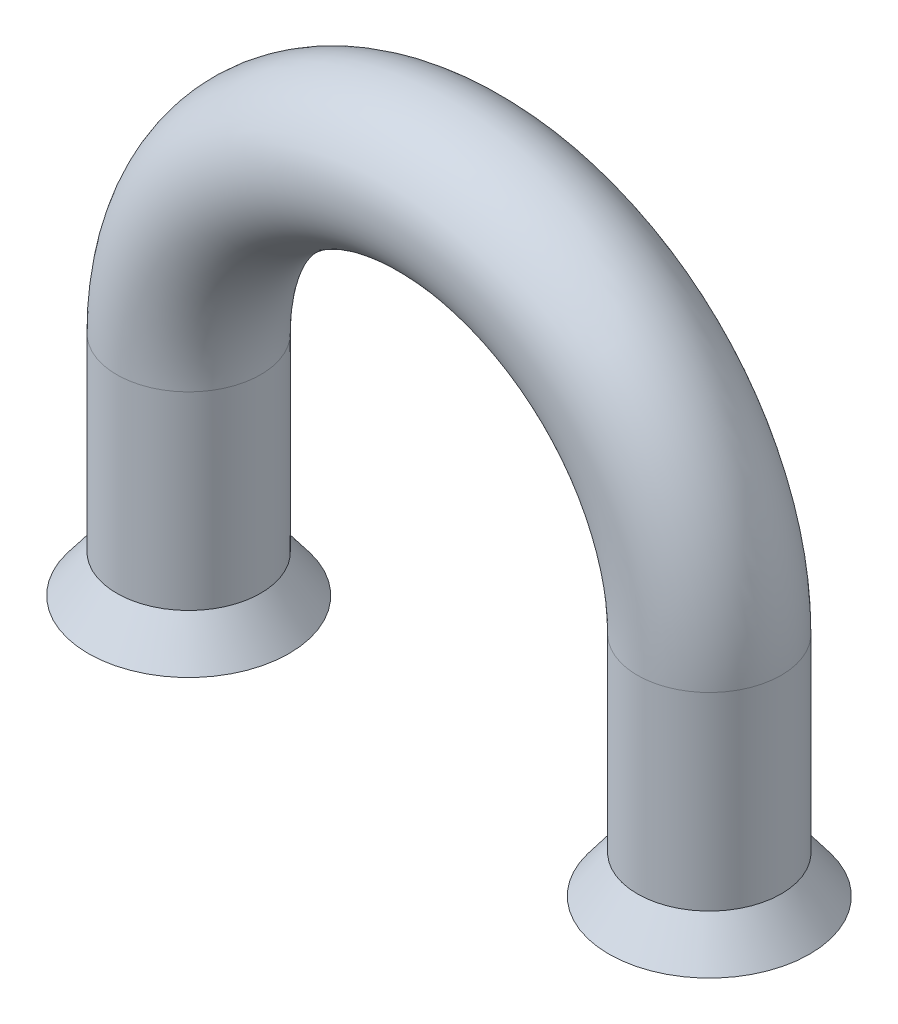
ISO-10303-21;
HEADER;
FILE_DESCRIPTION(('STEP AP214'),'2;1');
FILE_NAME('part.step','',(''),(''),'','','');
FILE_SCHEMA(('AUTOMOTIVE_DESIGN { 1 0 10303 214 1 1 1 1 }'));
ENDSEC;
DATA;
#1=APPLICATION_CONTEXT('core data for automotive mechanical design processes');
#2=APPLICATION_PROTOCOL_DEFINITION('international standard','automotive_design',2000,#1);
#3=PRODUCT_CONTEXT('',#1,'mechanical');
#4=PRODUCT('Part','Part','',(#3));
#5=PRODUCT_RELATED_PRODUCT_CATEGORY('part','',(#4));
#6=PRODUCT_DEFINITION_FORMATION('','',#4);
#7=PRODUCT_DEFINITION_CONTEXT('part definition',#1,'design');
#8=PRODUCT_DEFINITION('design','',#6,#7);
#9=PRODUCT_DEFINITION_SHAPE('','',#8);
#10=(LENGTH_UNIT() NAMED_UNIT(*) SI_UNIT(.MILLI.,.METRE.));
#11=(NAMED_UNIT(*) PLANE_ANGLE_UNIT() SI_UNIT($,.RADIAN.));
#12=(NAMED_UNIT(*) SI_UNIT($,.STERADIAN.) SOLID_ANGLE_UNIT());
#13=UNCERTAINTY_MEASURE_WITH_UNIT(LENGTH_MEASURE(1.E-05),#10,'distance_accuracy_value','');
#14=(GEOMETRIC_REPRESENTATION_CONTEXT(3) GLOBAL_UNCERTAINTY_ASSIGNED_CONTEXT((#13)) GLOBAL_UNIT_ASSIGNED_CONTEXT((#10,
#11,#12)) REPRESENTATION_CONTEXT('',''));
#15=CARTESIAN_POINT('',(0.,0.,0.));
#16=DIRECTION('',(0.,0.,1.));
#17=DIRECTION('',(1.,0.,0.));
#18=AXIS2_PLACEMENT_3D('',#15,#16,#17);
#19=CARTESIAN_POINT('',(0.,0.,0.));
#20=DIRECTION('',(0.,1.,0.));
#21=DIRECTION('',(0.,0.,1.));
#22=AXIS2_PLACEMENT_3D('',#19,#20,#21);
#23=CYLINDRICAL_SURFACE('',#22,4.826);
#24=CARTESIAN_POINT('',(0.,12.7,0.));
#25=DIRECTION('',(0.,1.,0.));
#26=DIRECTION('',(0.,0.,1.));
#27=AXIS2_PLACEMENT_3D('',#24,#25,#26);
#28=CIRCLE('',#27,4.826);
#29=CARTESIAN_POINT('',(-4.826,12.7,0.));
#30=VERTEX_POINT('',#29);
#31=EDGE_CURVE('E58',#30,#30,#28,.T.);
#32=ORIENTED_EDGE('',*,*,#31,.F.);
#33=EDGE_LOOP('',(#32));
#34=FACE_BOUND('',#33,.T.);
#35=CARTESIAN_POINT('',(0.,0.,0.));
#36=DIRECTION('',(0.,-1.,0.));
#37=DIRECTION('',(0.,0.,-1.));
#38=AXIS2_PLACEMENT_3D('',#35,#36,#37);
#39=CIRCLE('',#38,4.826);
#40=CARTESIAN_POINT('',(0.,0.,-4.826));
#41=VERTEX_POINT('',#40);
#42=EDGE_CURVE('E68',#41,#41,#39,.T.);
#43=ORIENTED_EDGE('',*,*,#42,.F.);
#44=EDGE_LOOP('',(#43));
#45=FACE_BOUND('',#44,.T.);
#46=ADVANCED_FACE('F37',(#34,#45),#23,.T.);
#47=CARTESIAN_POINT('',(17.4625,12.7,0.));
#48=DIRECTION('',(0.,0.,-1.));
#49=DIRECTION('',(-1.,0.,0.));
#50=AXIS2_PLACEMENT_3D('',#47,#48,#49);
#51=TOROIDAL_SURFACE('',#50,17.4625,4.826);
#52=CARTESIAN_POINT('',(34.925,12.7,0.));
#53=DIRECTION('',(0.,-1.,0.));
#54=DIRECTION('',(0.,0.,1.));
#55=AXIS2_PLACEMENT_3D('',#52,#53,#54);
#56=CIRCLE('',#55,4.826);
#57=CARTESIAN_POINT('',(39.751,12.7,0.));
#58=VERTEX_POINT('',#57);
#59=EDGE_CURVE('E41',#58,#58,#56,.T.);
#60=CARTESIAN_POINT('',(17.4625,12.7,0.));
#61=DIRECTION('',(0.,0.,-1.));
#62=DIRECTION('',(-1.,0.,0.));
#63=AXIS2_PLACEMENT_3D('',#60,#61,#62);
#64=CIRCLE('',#63,22.2885);
#65=EDGE_CURVE('',#30,#58,#64,.T.);
#66=ORIENTED_EDGE('',*,*,#31,.T.);
#67=ORIENTED_EDGE('',*,*,#59,.F.);
#68=ORIENTED_EDGE('',*,*,#65,.T.);
#69=ORIENTED_EDGE('',*,*,#65,.F.);
#70=EDGE_LOOP('',(#66,#68,#67,#69));
#71=FACE_BOUND('',#70,.T.);
#72=ADVANCED_FACE('F115',(#71),#51,.T.);
#73=CARTESIAN_POINT('',(34.925,12.7,0.));
#74=DIRECTION('',(0.,-1.,0.));
#75=DIRECTION('',(0.,0.,-1.));
#76=AXIS2_PLACEMENT_3D('',#73,#74,#75);
#77=CYLINDRICAL_SURFACE('',#76,4.826);
#78=CARTESIAN_POINT('',(34.925,0.,0.));
#79=DIRECTION('',(0.,-1.,0.));
#80=DIRECTION('',(0.,0.,1.));
#81=AXIS2_PLACEMENT_3D('',#78,#79,#80);
#82=CIRCLE('',#81,4.826);
#83=CARTESIAN_POINT('',(34.925,0.,4.826));
#84=VERTEX_POINT('',#83);
#85=EDGE_CURVE('E52',#84,#84,#82,.T.);
#86=ORIENTED_EDGE('',*,*,#85,.F.);
#87=EDGE_LOOP('',(#86));
#88=FACE_BOUND('',#87,.T.);
#89=ORIENTED_EDGE('',*,*,#59,.T.);
#90=EDGE_LOOP('',(#89));
#91=FACE_BOUND('',#90,.T.);
#92=ADVANCED_FACE('F39',(#88,#91),#77,.T.);
#93=CARTESIAN_POINT('',(0.,0.,0.));
#94=DIRECTION('',(0.,1.,0.));
#95=DIRECTION('',(0.,0.,1.));
#96=AXIS2_PLACEMENT_3D('',#93,#94,#95);
#97=CYLINDRICAL_SURFACE('',#96,4.064);
#98=CARTESIAN_POINT('',(0.,12.7,0.));
#99=DIRECTION('',(0.,1.,0.));
#100=DIRECTION('',(0.,0.,1.));
#101=AXIS2_PLACEMENT_3D('',#98,#99,#100);
#102=CIRCLE('',#101,4.064);
#103=CARTESIAN_POINT('',(-4.06400000000001,12.7,0.));
#104=VERTEX_POINT('',#103);
#105=EDGE_CURVE('E46',#104,#104,#102,.F.);
#106=ORIENTED_EDGE('',*,*,#105,.F.);
#107=EDGE_LOOP('',(#106));
#108=FACE_BOUND('',#107,.T.);
#109=CARTESIAN_POINT('',(0.,0.,0.));
#110=DIRECTION('',(0.,-1.,0.));
#111=DIRECTION('',(0.,0.,-1.));
#112=AXIS2_PLACEMENT_3D('',#109,#110,#111);
#113=CIRCLE('',#112,4.064);
#114=CARTESIAN_POINT('',(0.,0.,-4.064));
#115=VERTEX_POINT('',#114);
#116=EDGE_CURVE('E73',#115,#115,#113,.T.);
#117=ORIENTED_EDGE('',*,*,#116,.T.);
#118=EDGE_LOOP('',(#117));
#119=FACE_BOUND('',#118,.T.);
#120=ADVANCED_FACE('F114',(#108,#119),#97,.F.);
#121=CARTESIAN_POINT('',(17.4625,12.7,0.));
#122=DIRECTION('',(0.,0.,-1.));
#123=DIRECTION('',(-1.,0.,0.));
#124=AXIS2_PLACEMENT_3D('',#121,#122,#123);
#125=TOROIDAL_SURFACE('',#124,17.4625,4.064);
#126=CARTESIAN_POINT('',(34.925,12.7,0.));
#127=DIRECTION('',(0.,-1.,0.));
#128=DIRECTION('',(0.,0.,1.));
#129=AXIS2_PLACEMENT_3D('',#126,#127,#128);
#130=CIRCLE('',#129,4.064);
#131=CARTESIAN_POINT('',(38.989,12.7,0.));
#132=VERTEX_POINT('',#131);
#133=EDGE_CURVE('E10',#132,#132,#130,.F.);
#134=CARTESIAN_POINT('',(17.4625,12.7,0.));
#135=DIRECTION('',(0.,0.,-1.));
#136=DIRECTION('',(-1.,0.,0.));
#137=AXIS2_PLACEMENT_3D('',#134,#135,#136);
#138=CIRCLE('',#137,21.5265);
#139=EDGE_CURVE('',#104,#132,#138,.T.);
#140=ORIENTED_EDGE('',*,*,#105,.T.);
#141=ORIENTED_EDGE('',*,*,#133,.F.);
#142=ORIENTED_EDGE('',*,*,#139,.T.);
#143=ORIENTED_EDGE('',*,*,#139,.F.);
#144=EDGE_LOOP('',(#140,#142,#141,#143));
#145=FACE_BOUND('',#144,.T.);
#146=ADVANCED_FACE('F127',(#145),#125,.F.);
#147=CARTESIAN_POINT('',(34.925,12.7,0.));
#148=DIRECTION('',(0.,-1.,0.));
#149=DIRECTION('',(0.,0.,-1.));
#150=AXIS2_PLACEMENT_3D('',#147,#148,#149);
#151=CYLINDRICAL_SURFACE('',#150,4.064);
#152=CARTESIAN_POINT('',(34.925,0.,0.));
#153=DIRECTION('',(0.,-1.,0.));
#154=DIRECTION('',(1.,0.,0.));
#155=AXIS2_PLACEMENT_3D('',#152,#153,#154);
#156=CIRCLE('',#155,4.064);
#157=CARTESIAN_POINT('',(38.989,0.,0.));
#158=VERTEX_POINT('',#157);
#159=EDGE_CURVE('E87',#158,#158,#156,.T.);
#160=ORIENTED_EDGE('',*,*,#159,.T.);
#161=EDGE_LOOP('',(#160));
#162=FACE_BOUND('',#161,.T.);
#163=ORIENTED_EDGE('',*,*,#133,.T.);
#164=EDGE_LOOP('',(#163));
#165=FACE_BOUND('',#164,.T.);
#166=ADVANCED_FACE('F125',(#162,#165),#151,.F.);
#167=CARTESIAN_POINT('',(0.,0.,0.));
#168=DIRECTION('',(0.,-1.,0.));
#169=DIRECTION('',(0.,0.,-1.));
#170=AXIS2_PLACEMENT_3D('',#167,#168,#169);
#171=CONICAL_SURFACE('',#170,4.826,0.645771823237903);
#172=CARTESIAN_POINT('',(0.,-2.54,0.));
#173=DIRECTION('',(0.,-1.,0.));
#174=DIRECTION('',(0.,0.,-1.));
#175=AXIS2_PLACEMENT_3D('',#172,#173,#174);
#176=CIRCLE('',#175,6.7400272872611);
#177=CARTESIAN_POINT('',(0.,-2.54,-6.7400272872611));
#178=VERTEX_POINT('',#177);
#179=EDGE_CURVE('E61',#178,#178,#176,.T.);
#180=ORIENTED_EDGE('',*,*,#179,.F.);
#181=EDGE_LOOP('',(#180));
#182=FACE_BOUND('',#181,.T.);
#183=ORIENTED_EDGE('',*,*,#42,.T.);
#184=EDGE_LOOP('',(#183));
#185=FACE_BOUND('',#184,.T.);
#186=ADVANCED_FACE('F124',(#182,#185),#171,.T.);
#187=CARTESIAN_POINT('',(0.,-2.54,0.));
#188=DIRECTION('',(0.,-1.,0.));
#189=DIRECTION('',(0.,0.,-1.));
#190=AXIS2_PLACEMENT_3D('',#187,#188,#189);
#191=PLANE('',#190);
#192=CARTESIAN_POINT('',(0.,-2.54,0.));
#193=DIRECTION('',(0.,-1.,0.));
#194=DIRECTION('',(0.,0.,-1.));
#195=AXIS2_PLACEMENT_3D('',#192,#193,#194);
#196=CIRCLE('',#195,5.9780272872611);
#197=CARTESIAN_POINT('',(0.,-2.54,-5.9780272872611));
#198=VERTEX_POINT('',#197);
#199=EDGE_CURVE('E79',#198,#198,#196,.T.);
#200=ORIENTED_EDGE('',*,*,#199,.F.);
#201=EDGE_LOOP('',(#200));
#202=FACE_BOUND('',#201,.T.);
#203=ORIENTED_EDGE('',*,*,#179,.T.);
#204=EDGE_LOOP('',(#203));
#205=FACE_BOUND('',#204,.T.);
#206=ADVANCED_FACE('F134',(#202,#205),#191,.T.);
#207=CARTESIAN_POINT('',(0.,-2.54,0.));
#208=DIRECTION('',(0.,-1.,0.));
#209=DIRECTION('',(0.,0.,-1.));
#210=AXIS2_PLACEMENT_3D('',#207,#208,#209);
#211=CONICAL_SURFACE('',#210,5.9780272872611,0.645771823237903);
#212=ORIENTED_EDGE('',*,*,#199,.T.);
#213=EDGE_LOOP('',(#212));
#214=FACE_BOUND('',#213,.T.);
#215=ORIENTED_EDGE('',*,*,#116,.F.);
#216=EDGE_LOOP('',(#215));
#217=FACE_BOUND('',#216,.T.);
#218=ADVANCED_FACE('F108',(#214,#217),#211,.F.);
#219=CARTESIAN_POINT('',(34.925,0.,0.));
#220=DIRECTION('',(0.,-1.,0.));
#221=DIRECTION('',(1.,0.,0.));
#222=AXIS2_PLACEMENT_3D('',#219,#220,#221);
#223=CONICAL_SURFACE('',#222,4.826,0.645771823237903);
#224=CARTESIAN_POINT('',(34.925,-2.54,0.));
#225=DIRECTION('',(0.,-1.,0.));
#226=DIRECTION('',(1.,0.,0.));
#227=AXIS2_PLACEMENT_3D('',#224,#225,#226);
#228=CIRCLE('',#227,6.7400272872611);
#229=CARTESIAN_POINT('',(41.6650272872611,-2.54,0.));
#230=VERTEX_POINT('',#229);
#231=EDGE_CURVE('E83',#230,#230,#228,.T.);
#232=ORIENTED_EDGE('',*,*,#231,.F.);
#233=EDGE_LOOP('',(#232));
#234=FACE_BOUND('',#233,.T.);
#235=ORIENTED_EDGE('',*,*,#85,.T.);
#236=EDGE_LOOP('',(#235));
#237=FACE_BOUND('',#236,.T.);
#238=ADVANCED_FACE('F102',(#234,#237),#223,.T.);
#239=CARTESIAN_POINT('',(34.925,-2.54,0.));
#240=DIRECTION('',(0.,-1.,0.));
#241=DIRECTION('',(1.,0.,0.));
#242=AXIS2_PLACEMENT_3D('',#239,#240,#241);
#243=PLANE('',#242);
#244=CARTESIAN_POINT('',(34.925,-2.54,0.));
#245=DIRECTION('',(0.,-1.,0.));
#246=DIRECTION('',(1.,0.,0.));
#247=AXIS2_PLACEMENT_3D('',#244,#245,#246);
#248=CIRCLE('',#247,5.9780272872611);
#249=CARTESIAN_POINT('',(40.9030272872611,-2.54,0.));
#250=VERTEX_POINT('',#249);
#251=EDGE_CURVE('E91',#250,#250,#248,.T.);
#252=ORIENTED_EDGE('',*,*,#251,.F.);
#253=EDGE_LOOP('',(#252));
#254=FACE_BOUND('',#253,.T.);
#255=ORIENTED_EDGE('',*,*,#231,.T.);
#256=EDGE_LOOP('',(#255));
#257=FACE_BOUND('',#256,.T.);
#258=ADVANCED_FACE('F99',(#254,#257),#243,.T.);
#259=CARTESIAN_POINT('',(34.925,-2.54,0.));
#260=DIRECTION('',(0.,-1.,0.));
#261=DIRECTION('',(1.,0.,0.));
#262=AXIS2_PLACEMENT_3D('',#259,#260,#261);
#263=CONICAL_SURFACE('',#262,5.9780272872611,0.645771823237903);
#264=ORIENTED_EDGE('',*,*,#251,.T.);
#265=EDGE_LOOP('',(#264));
#266=FACE_BOUND('',#265,.T.);
#267=ORIENTED_EDGE('',*,*,#159,.F.);
#268=EDGE_LOOP('',(#267));
#269=FACE_BOUND('',#268,.T.);
#270=ADVANCED_FACE('F96',(#266,#269),#263,.F.);
#271=CLOSED_SHELL('',(#46,#72,#92,#120,#146,#166,#186,#206,#218,#238,#258,#270));
#272=MANIFOLD_SOLID_BREP('B2',#271);
#273=ADVANCED_BREP_SHAPE_REPRESENTATION('',(#18,#272),#14);
#274=SHAPE_DEFINITION_REPRESENTATION(#9,#273);
ENDSEC;
END-ISO-10303-21;
